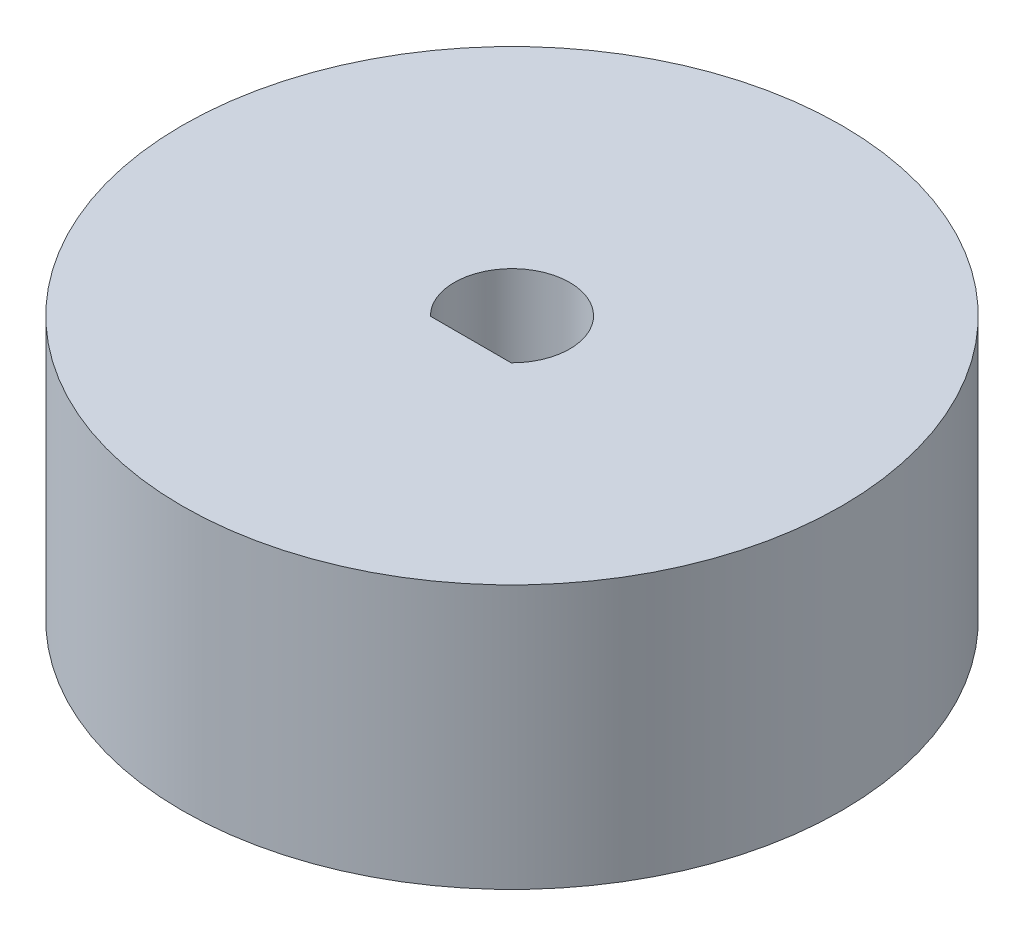
ISO-10303-21;
HEADER;
FILE_DESCRIPTION(('STEP AP214'),'2;1');
FILE_NAME('part.step','',(''),(''),'','','');
FILE_SCHEMA(('AUTOMOTIVE_DESIGN { 1 0 10303 214 1 1 1 1 }'));
ENDSEC;
DATA;
#1=APPLICATION_CONTEXT('core data for automotive mechanical design processes');
#2=APPLICATION_PROTOCOL_DEFINITION('international standard','automotive_design',2000,#1);
#3=PRODUCT_CONTEXT('',#1,'mechanical');
#4=PRODUCT('Part','Part','',(#3));
#5=PRODUCT_RELATED_PRODUCT_CATEGORY('part','',(#4));
#6=PRODUCT_DEFINITION_FORMATION('','',#4);
#7=PRODUCT_DEFINITION_CONTEXT('part definition',#1,'design');
#8=PRODUCT_DEFINITION('design','',#6,#7);
#9=PRODUCT_DEFINITION_SHAPE('','',#8);
#10=(LENGTH_UNIT() NAMED_UNIT(*) SI_UNIT(.MILLI.,.METRE.));
#11=(NAMED_UNIT(*) PLANE_ANGLE_UNIT() SI_UNIT($,.RADIAN.));
#12=(NAMED_UNIT(*) SI_UNIT($,.STERADIAN.) SOLID_ANGLE_UNIT());
#13=UNCERTAINTY_MEASURE_WITH_UNIT(LENGTH_MEASURE(1.E-05),#10,'distance_accuracy_value','');
#14=(GEOMETRIC_REPRESENTATION_CONTEXT(3) GLOBAL_UNCERTAINTY_ASSIGNED_CONTEXT((#13)) GLOBAL_UNIT_ASSIGNED_CONTEXT((#10,
#11,#12)) REPRESENTATION_CONTEXT('',''));
#15=CARTESIAN_POINT('',(0.,0.,0.));
#16=DIRECTION('',(0.,0.,1.));
#17=DIRECTION('',(1.,0.,0.));
#18=AXIS2_PLACEMENT_3D('',#15,#16,#17);
#19=CARTESIAN_POINT('',(0.,10.16,0.));
#20=DIRECTION('',(0.,-1.,0.));
#21=DIRECTION('',(0.,0.,-1.));
#22=AXIS2_PLACEMENT_3D('',#19,#20,#21);
#23=CYLINDRICAL_SURFACE('',#22,12.7);
#24=CARTESIAN_POINT('',(0.,10.16,0.));
#25=DIRECTION('',(0.,1.,0.));
#26=DIRECTION('',(0.,0.,1.));
#27=AXIS2_PLACEMENT_3D('',#24,#25,#26);
#28=CIRCLE('',#27,12.7);
#29=CARTESIAN_POINT('',(0.,10.16,12.7));
#30=VERTEX_POINT('',#29);
#31=EDGE_CURVE('E11',#30,#30,#28,.T.);
#32=ORIENTED_EDGE('',*,*,#31,.F.);
#33=EDGE_LOOP('',(#32));
#34=FACE_BOUND('',#33,.T.);
#35=CARTESIAN_POINT('',(0.,0.,0.));
#36=DIRECTION('',(0.,1.,0.));
#37=DIRECTION('',(0.,0.,1.));
#38=AXIS2_PLACEMENT_3D('',#35,#36,#37);
#39=CIRCLE('',#38,12.7);
#40=CARTESIAN_POINT('',(0.,0.,12.7));
#41=VERTEX_POINT('',#40);
#42=EDGE_CURVE('E40',#41,#41,#39,.T.);
#43=ORIENTED_EDGE('',*,*,#42,.T.);
#44=EDGE_LOOP('',(#43));
#45=FACE_BOUND('',#44,.T.);
#46=ADVANCED_FACE('F37',(#34,#45),#23,.T.);
#47=CARTESIAN_POINT('',(0.,10.16,0.));
#48=DIRECTION('',(0.,1.,0.));
#49=DIRECTION('',(0.,0.,1.));
#50=AXIS2_PLACEMENT_3D('',#47,#48,#49);
#51=PLANE('',#50);
#52=CARTESIAN_POINT('',(0.,10.16,0.));
#53=DIRECTION('',(0.,1.,0.));
#54=DIRECTION('',(0.,0.,1.));
#55=AXIS2_PLACEMENT_3D('',#52,#53,#54);
#56=CIRCLE('',#55,2.2225);
#57=CARTESIAN_POINT('',(1.55542598666732,10.16,1.5875));
#58=VERTEX_POINT('',#57);
#59=CARTESIAN_POINT('',(-1.55542598666732,10.16,1.5875));
#60=VERTEX_POINT('',#59);
#61=EDGE_CURVE('E51',#58,#60,#56,.T.);
#62=ORIENTED_EDGE('',*,*,#61,.F.);
#63=DIRECTION('',(1.,0.,0.));
#64=VECTOR('',#63,1.);
#65=CARTESIAN_POINT('',(-1.55542598666732,10.16,1.5875));
#66=LINE('',#65,#64);
#67=EDGE_CURVE('E70',#60,#58,#66,.T.);
#68=ORIENTED_EDGE('',*,*,#67,.F.);
#69=EDGE_LOOP('',(#62,#68));
#70=FACE_BOUND('',#69,.T.);
#71=ORIENTED_EDGE('',*,*,#31,.T.);
#72=EDGE_LOOP('',(#71));
#73=FACE_BOUND('',#72,.T.);
#74=ADVANCED_FACE('F74',(#70,#73),#51,.T.);
#75=CARTESIAN_POINT('',(0.,0.,0.));
#76=DIRECTION('',(0.,1.,0.));
#77=DIRECTION('',(0.,0.,1.));
#78=AXIS2_PLACEMENT_3D('',#75,#76,#77);
#79=PLANE('',#78);
#80=DIRECTION('',(1.,0.,0.));
#81=VECTOR('',#80,1.);
#82=CARTESIAN_POINT('',(-1.55542598666732,0.,1.5875));
#83=LINE('',#82,#81);
#84=CARTESIAN_POINT('',(-1.55542598666732,0.,1.5875));
#85=VERTEX_POINT('',#84);
#86=CARTESIAN_POINT('',(1.55542598666732,0.,1.5875));
#87=VERTEX_POINT('',#86);
#88=EDGE_CURVE('E78',#85,#87,#83,.T.);
#89=ORIENTED_EDGE('',*,*,#88,.T.);
#90=CARTESIAN_POINT('',(0.,0.,0.));
#91=DIRECTION('',(0.,1.,0.));
#92=DIRECTION('',(0.,0.,1.));
#93=AXIS2_PLACEMENT_3D('',#90,#91,#92);
#94=CIRCLE('',#93,2.2225);
#95=EDGE_CURVE('E56',#87,#85,#94,.T.);
#96=ORIENTED_EDGE('',*,*,#95,.T.);
#97=EDGE_LOOP('',(#89,#96));
#98=FACE_BOUND('',#97,.T.);
#99=ORIENTED_EDGE('',*,*,#42,.F.);
#100=EDGE_LOOP('',(#99));
#101=FACE_BOUND('',#100,.T.);
#102=ADVANCED_FACE('F82',(#98,#101),#79,.F.);
#103=CARTESIAN_POINT('',(0.,0.,0.));
#104=DIRECTION('',(0.,1.,0.));
#105=DIRECTION('',(0.,0.,1.));
#106=AXIS2_PLACEMENT_3D('',#103,#104,#105);
#107=CYLINDRICAL_SURFACE('',#106,2.2225);
#108=ORIENTED_EDGE('',*,*,#61,.T.);
#109=DIRECTION('',(0.,1.,0.));
#110=VECTOR('',#109,1.);
#111=CARTESIAN_POINT('',(-1.55542598666732,0.,1.5875));
#112=LINE('',#111,#110);
#113=EDGE_CURVE('E67',#85,#60,#112,.T.);
#114=ORIENTED_EDGE('',*,*,#113,.F.);
#115=ORIENTED_EDGE('',*,*,#95,.F.);
#116=DIRECTION('',(0.,1.,0.));
#117=VECTOR('',#116,1.);
#118=CARTESIAN_POINT('',(1.55542598666732,0.,1.5875));
#119=LINE('',#118,#117);
#120=EDGE_CURVE('E61',#87,#58,#119,.T.);
#121=ORIENTED_EDGE('',*,*,#120,.T.);
#122=EDGE_LOOP('',(#108,#114,#115,#121));
#123=FACE_BOUND('',#122,.T.);
#124=ADVANCED_FACE('F63',(#123),#107,.F.);
#125=CARTESIAN_POINT('',(-1.55542598666732,0.,1.5875));
#126=DIRECTION('',(0.,0.,1.));
#127=DIRECTION('',(1.,0.,0.));
#128=AXIS2_PLACEMENT_3D('',#125,#126,#127);
#129=PLANE('',#128);
#130=ORIENTED_EDGE('',*,*,#67,.T.);
#131=ORIENTED_EDGE('',*,*,#120,.F.);
#132=ORIENTED_EDGE('',*,*,#88,.F.);
#133=ORIENTED_EDGE('',*,*,#113,.T.);
#134=EDGE_LOOP('',(#130,#131,#132,#133));
#135=FACE_BOUND('',#134,.T.);
#136=ADVANCED_FACE('F71',(#135),#129,.F.);
#137=CLOSED_SHELL('',(#46,#74,#102,#124,#136));
#138=MANIFOLD_SOLID_BREP('B2',#137);
#139=ADVANCED_BREP_SHAPE_REPRESENTATION('',(#18,#138),#14);
#140=SHAPE_DEFINITION_REPRESENTATION(#9,#139);
ENDSEC;
END-ISO-10303-21;
